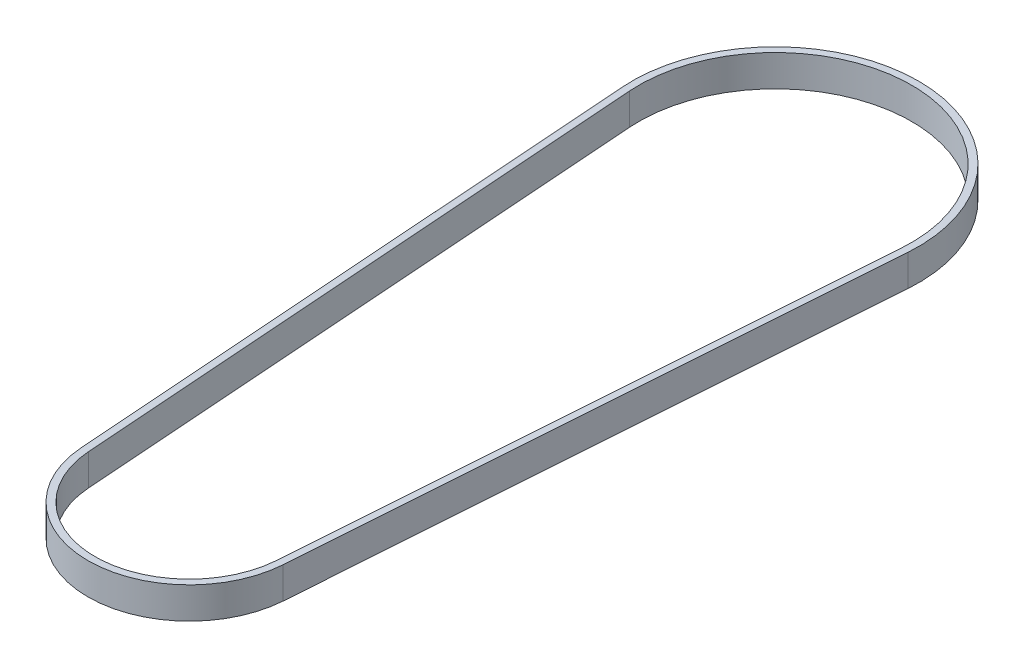
ISO-10303-21;
HEADER;
FILE_DESCRIPTION(('STEP AP214'),'2;1');
FILE_NAME('part.step','',(''),(''),'','','');
FILE_SCHEMA(('AUTOMOTIVE_DESIGN { 1 0 10303 214 1 1 1 1 }'));
ENDSEC;
DATA;
#1=APPLICATION_CONTEXT('core data for automotive mechanical design processes');
#2=APPLICATION_PROTOCOL_DEFINITION('international standard','automotive_design',2000,#1);
#3=PRODUCT_CONTEXT('',#1,'mechanical');
#4=PRODUCT('Part','Part','',(#3));
#5=PRODUCT_RELATED_PRODUCT_CATEGORY('part','',(#4));
#6=PRODUCT_DEFINITION_FORMATION('','',#4);
#7=PRODUCT_DEFINITION_CONTEXT('part definition',#1,'design');
#8=PRODUCT_DEFINITION('design','',#6,#7);
#9=PRODUCT_DEFINITION_SHAPE('','',#8);
#10=(LENGTH_UNIT() NAMED_UNIT(*) SI_UNIT(.MILLI.,.METRE.));
#11=(NAMED_UNIT(*) PLANE_ANGLE_UNIT() SI_UNIT($,.RADIAN.));
#12=(NAMED_UNIT(*) SI_UNIT($,.STERADIAN.) SOLID_ANGLE_UNIT());
#13=UNCERTAINTY_MEASURE_WITH_UNIT(LENGTH_MEASURE(1.E-05),#10,'distance_accuracy_value','');
#14=(GEOMETRIC_REPRESENTATION_CONTEXT(3) GLOBAL_UNCERTAINTY_ASSIGNED_CONTEXT((#13)) GLOBAL_UNIT_ASSIGNED_CONTEXT((#10,
#11,#12)) REPRESENTATION_CONTEXT('',''));
#15=CARTESIAN_POINT('',(0.,0.,0.));
#16=DIRECTION('',(0.,0.,1.));
#17=DIRECTION('',(1.,0.,0.));
#18=AXIS2_PLACEMENT_3D('',#15,#16,#17);
#19=CARTESIAN_POINT('',(0.,4.5,83.81));
#20=DIRECTION('',(0.,1.,0.));
#21=DIRECTION('',(0.,0.,1.));
#22=AXIS2_PLACEMENT_3D('',#19,#20,#21);
#23=PLANE('',#22);
#24=CARTESIAN_POINT('',(0.,4.5,83.81));
#25=DIRECTION('',(0.,1.,0.));
#26=DIRECTION('',(0.,0.,1.));
#27=AXIS2_PLACEMENT_3D('',#24,#25,#26);
#28=CIRCLE('',#27,14.5);
#29=CARTESIAN_POINT('',(-14.462794567271,4.5,84.848062283737));
#30=VERTEX_POINT('',#29);
#31=CARTESIAN_POINT('',(14.462794567271,4.5,84.848062283737));
#32=VERTEX_POINT('',#31);
#33=EDGE_CURVE('E159',#30,#32,#28,.T.);
#34=ORIENTED_EDGE('',*,*,#33,.T.);
#35=DIRECTION('',(0.0715905023266914,0.,-0.997434108087653));
#36=VECTOR('',#35,1.);
#37=CARTESIAN_POINT('',(20.4473992157969,4.5,1.46760529769717));
#38=LINE('',#37,#36);
#39=CARTESIAN_POINT('',(20.4473992157969,4.5,1.46760529769717));
#40=VERTEX_POINT('',#39);
#41=EDGE_CURVE('E163',#32,#40,#38,.T.);
#42=ORIENTED_EDGE('',*,*,#41,.T.);
#43=CARTESIAN_POINT('',(0.,4.5,0.));
#44=DIRECTION('',(0.,1.,0.));
#45=DIRECTION('',(0.,0.,1.));
#46=AXIS2_PLACEMENT_3D('',#43,#44,#45);
#47=CIRCLE('',#46,20.5);
#48=CARTESIAN_POINT('',(-20.4473992157969,4.5,1.46760529769717));
#49=VERTEX_POINT('',#48);
#50=EDGE_CURVE('E167',#40,#49,#47,.T.);
#51=ORIENTED_EDGE('',*,*,#50,.T.);
#52=DIRECTION('',(0.0715905023266914,0.,0.997434108087653));
#53=VECTOR('',#52,1.);
#54=CARTESIAN_POINT('',(-20.4473992157969,4.5,1.46760529769717));
#55=LINE('',#54,#53);
#56=EDGE_CURVE('E170',#49,#30,#55,.T.);
#57=ORIENTED_EDGE('',*,*,#56,.T.);
#58=EDGE_LOOP('',(#34,#42,#51,#57));
#59=FACE_BOUND('',#58,.T.);
#60=DIRECTION('',(0.0715905023266914,0.,0.997434108087653));
#61=VECTOR('',#60,1.);
#62=CARTESIAN_POINT('',(-19.4499651077092,4.5,1.39601479537047));
#63=LINE('',#62,#61);
#64=CARTESIAN_POINT('',(-19.4499651077092,4.5,1.39601479537047));
#65=VERTEX_POINT('',#64);
#66=CARTESIAN_POINT('',(-13.4653604591833,4.5,84.7764717814103));
#67=VERTEX_POINT('',#66);
#68=EDGE_CURVE('E120',#65,#67,#63,.T.);
#69=ORIENTED_EDGE('',*,*,#68,.F.);
#70=CARTESIAN_POINT('',(0.,4.5,0.));
#71=DIRECTION('',(0.,1.,0.));
#72=DIRECTION('',(0.,0.,1.));
#73=AXIS2_PLACEMENT_3D('',#70,#71,#72);
#74=CIRCLE('',#73,19.5);
#75=CARTESIAN_POINT('',(19.4499651077092,4.5,1.39601479537048));
#76=VERTEX_POINT('',#75);
#77=EDGE_CURVE('E111',#76,#65,#74,.T.);
#78=ORIENTED_EDGE('',*,*,#77,.F.);
#79=DIRECTION('',(0.0715905023266913,0.,-0.997434108087653));
#80=VECTOR('',#79,1.);
#81=CARTESIAN_POINT('',(19.4499651077092,4.5,1.39601479537048));
#82=LINE('',#81,#80);
#83=CARTESIAN_POINT('',(13.4653604591833,4.5,84.7764717814103));
#84=VERTEX_POINT('',#83);
#85=EDGE_CURVE('E137',#84,#76,#82,.T.);
#86=ORIENTED_EDGE('',*,*,#85,.F.);
#87=CARTESIAN_POINT('',(0.,4.5,83.81));
#88=DIRECTION('',(0.,1.,0.));
#89=DIRECTION('',(0.,0.,1.));
#90=AXIS2_PLACEMENT_3D('',#87,#88,#89);
#91=CIRCLE('',#90,13.5);
#92=EDGE_CURVE('E133',#67,#84,#91,.T.);
#93=ORIENTED_EDGE('',*,*,#92,.F.);
#94=EDGE_LOOP('',(#69,#78,#86,#93));
#95=FACE_BOUND('',#94,.T.);
#96=ADVANCED_FACE('F45',(#59,#95),#23,.T.);
#97=CARTESIAN_POINT('',(0.,0.,83.81));
#98=DIRECTION('',(0.,1.,0.));
#99=DIRECTION('',(0.,0.,1.));
#100=AXIS2_PLACEMENT_3D('',#97,#98,#99);
#101=PLANE('',#100);
#102=CARTESIAN_POINT('',(0.,0.,83.81));
#103=DIRECTION('',(0.,1.,0.));
#104=DIRECTION('',(0.,0.,1.));
#105=AXIS2_PLACEMENT_3D('',#102,#103,#104);
#106=CIRCLE('',#105,14.5);
#107=CARTESIAN_POINT('',(-14.462794567271,0.,84.848062283737));
#108=VERTEX_POINT('',#107);
#109=CARTESIAN_POINT('',(14.462794567271,0.,84.848062283737));
#110=VERTEX_POINT('',#109);
#111=EDGE_CURVE('E129',#108,#110,#106,.T.);
#112=ORIENTED_EDGE('',*,*,#111,.F.);
#113=DIRECTION('',(0.0715905023266914,0.,0.997434108087653));
#114=VECTOR('',#113,1.);
#115=CARTESIAN_POINT('',(-20.4473992157969,0.,1.46760529769717));
#116=LINE('',#115,#114);
#117=CARTESIAN_POINT('',(-20.4473992157969,0.,1.46760529769717));
#118=VERTEX_POINT('',#117);
#119=EDGE_CURVE('E164',#118,#108,#116,.T.);
#120=ORIENTED_EDGE('',*,*,#119,.F.);
#121=CARTESIAN_POINT('',(0.,0.,0.));
#122=DIRECTION('',(0.,1.,0.));
#123=DIRECTION('',(0.,0.,1.));
#124=AXIS2_PLACEMENT_3D('',#121,#122,#123);
#125=CIRCLE('',#124,20.5);
#126=CARTESIAN_POINT('',(20.4473992157969,0.,1.46760529769717));
#127=VERTEX_POINT('',#126);
#128=EDGE_CURVE('E180',#127,#118,#125,.T.);
#129=ORIENTED_EDGE('',*,*,#128,.F.);
#130=DIRECTION('',(0.0715905023266914,0.,-0.997434108087653));
#131=VECTOR('',#130,1.);
#132=CARTESIAN_POINT('',(20.4473992157969,0.,1.46760529769717));
#133=LINE('',#132,#131);
#134=EDGE_CURVE('E177',#110,#127,#133,.T.);
#135=ORIENTED_EDGE('',*,*,#134,.F.);
#136=EDGE_LOOP('',(#112,#120,#129,#135));
#137=FACE_BOUND('',#136,.T.);
#138=CARTESIAN_POINT('',(0.,0.,0.));
#139=DIRECTION('',(0.,1.,0.));
#140=DIRECTION('',(0.,0.,1.));
#141=AXIS2_PLACEMENT_3D('',#138,#139,#140);
#142=CIRCLE('',#141,19.5);
#143=CARTESIAN_POINT('',(19.4499651077092,0.,1.39601479537048));
#144=VERTEX_POINT('',#143);
#145=CARTESIAN_POINT('',(-19.4499651077092,0.,1.39601479537047));
#146=VERTEX_POINT('',#145);
#147=EDGE_CURVE('E69',#144,#146,#142,.T.);
#148=ORIENTED_EDGE('',*,*,#147,.T.);
#149=DIRECTION('',(0.0715905023266914,0.,0.997434108087653));
#150=VECTOR('',#149,1.);
#151=CARTESIAN_POINT('',(-19.4499651077092,0.,1.39601479537047));
#152=LINE('',#151,#150);
#153=CARTESIAN_POINT('',(-13.4653604591833,0.,84.7764717814103));
#154=VERTEX_POINT('',#153);
#155=EDGE_CURVE('E127',#146,#154,#152,.T.);
#156=ORIENTED_EDGE('',*,*,#155,.T.);
#157=CARTESIAN_POINT('',(0.,0.,83.81));
#158=DIRECTION('',(0.,1.,0.));
#159=DIRECTION('',(0.,0.,1.));
#160=AXIS2_PLACEMENT_3D('',#157,#158,#159);
#161=CIRCLE('',#160,13.5);
#162=CARTESIAN_POINT('',(13.4653604591833,0.,84.7764717814103));
#163=VERTEX_POINT('',#162);
#164=EDGE_CURVE('E146',#154,#163,#161,.T.);
#165=ORIENTED_EDGE('',*,*,#164,.T.);
#166=DIRECTION('',(0.0715905023266913,0.,-0.997434108087653));
#167=VECTOR('',#166,1.);
#168=CARTESIAN_POINT('',(19.4499651077092,0.,1.39601479537048));
#169=LINE('',#168,#167);
#170=EDGE_CURVE('E121',#163,#144,#169,.T.);
#171=ORIENTED_EDGE('',*,*,#170,.T.);
#172=EDGE_LOOP('',(#148,#156,#165,#171));
#173=FACE_BOUND('',#172,.T.);
#174=ADVANCED_FACE('F203',(#137,#173),#101,.F.);
#175=CARTESIAN_POINT('',(0.,4.5,83.81));
#176=DIRECTION('',(0.,-1.,0.));
#177=DIRECTION('',(0.,0.,-1.));
#178=AXIS2_PLACEMENT_3D('',#175,#176,#177);
#179=CYLINDRICAL_SURFACE('',#178,14.5);
#180=ORIENTED_EDGE('',*,*,#111,.T.);
#181=DIRECTION('',(0.,-1.,0.));
#182=VECTOR('',#181,1.);
#183=CARTESIAN_POINT('',(14.462794567271,4.5,84.848062283737));
#184=LINE('',#183,#182);
#185=EDGE_CURVE('E11',#32,#110,#184,.T.);
#186=ORIENTED_EDGE('',*,*,#185,.F.);
#187=ORIENTED_EDGE('',*,*,#33,.F.);
#188=DIRECTION('',(0.,-1.,0.));
#189=VECTOR('',#188,1.);
#190=CARTESIAN_POINT('',(-14.462794567271,4.5,84.848062283737));
#191=LINE('',#190,#189);
#192=EDGE_CURVE('E173',#30,#108,#191,.T.);
#193=ORIENTED_EDGE('',*,*,#192,.T.);
#194=EDGE_LOOP('',(#180,#186,#187,#193));
#195=FACE_BOUND('',#194,.T.);
#196=ADVANCED_FACE('F47',(#195),#179,.T.);
#197=CARTESIAN_POINT('',(20.4473992157969,4.5,1.46760529769717));
#198=DIRECTION('',(-0.997434108087653,0.,-0.0715905023266914));
#199=DIRECTION('',(-0.0715905023266914,0.,0.997434108087653));
#200=AXIS2_PLACEMENT_3D('',#197,#198,#199);
#201=PLANE('',#200);
#202=ORIENTED_EDGE('',*,*,#134,.T.);
#203=DIRECTION('',(0.,-1.,0.));
#204=VECTOR('',#203,1.);
#205=CARTESIAN_POINT('',(20.4473992157969,4.5,1.46760529769717));
#206=LINE('',#205,#204);
#207=EDGE_CURVE('E54',#40,#127,#206,.T.);
#208=ORIENTED_EDGE('',*,*,#207,.F.);
#209=ORIENTED_EDGE('',*,*,#41,.F.);
#210=ORIENTED_EDGE('',*,*,#185,.T.);
#211=EDGE_LOOP('',(#202,#208,#209,#210));
#212=FACE_BOUND('',#211,.T.);
#213=ADVANCED_FACE('F213',(#212),#201,.F.);
#214=CARTESIAN_POINT('',(0.,4.5,0.));
#215=DIRECTION('',(0.,-1.,0.));
#216=DIRECTION('',(0.,0.,-1.));
#217=AXIS2_PLACEMENT_3D('',#214,#215,#216);
#218=CYLINDRICAL_SURFACE('',#217,20.5);
#219=ORIENTED_EDGE('',*,*,#128,.T.);
#220=DIRECTION('',(0.,-1.,0.));
#221=VECTOR('',#220,1.);
#222=CARTESIAN_POINT('',(-20.4473992157969,4.5,1.46760529769717));
#223=LINE('',#222,#221);
#224=EDGE_CURVE('E188',#49,#118,#223,.T.);
#225=ORIENTED_EDGE('',*,*,#224,.F.);
#226=ORIENTED_EDGE('',*,*,#50,.F.);
#227=ORIENTED_EDGE('',*,*,#207,.T.);
#228=EDGE_LOOP('',(#219,#225,#226,#227));
#229=FACE_BOUND('',#228,.T.);
#230=ADVANCED_FACE('F197',(#229),#218,.T.);
#231=CARTESIAN_POINT('',(-20.4473992157969,4.5,1.46760529769717));
#232=DIRECTION('',(0.997434108087653,0.,-0.0715905023266914));
#233=DIRECTION('',(-0.0715905023266914,0.,-0.997434108087653));
#234=AXIS2_PLACEMENT_3D('',#231,#232,#233);
#235=PLANE('',#234);
#236=ORIENTED_EDGE('',*,*,#119,.T.);
#237=ORIENTED_EDGE('',*,*,#192,.F.);
#238=ORIENTED_EDGE('',*,*,#56,.F.);
#239=ORIENTED_EDGE('',*,*,#224,.T.);
#240=EDGE_LOOP('',(#236,#237,#238,#239));
#241=FACE_BOUND('',#240,.T.);
#242=ADVANCED_FACE('F207',(#241),#235,.F.);
#243=CARTESIAN_POINT('',(0.,4.5,0.));
#244=DIRECTION('',(0.,-1.,0.));
#245=DIRECTION('',(0.,0.,-1.));
#246=AXIS2_PLACEMENT_3D('',#243,#244,#245);
#247=CYLINDRICAL_SURFACE('',#246,19.5);
#248=ORIENTED_EDGE('',*,*,#147,.F.);
#249=DIRECTION('',(0.,-1.,0.));
#250=VECTOR('',#249,1.);
#251=CARTESIAN_POINT('',(19.4499651077092,4.5,1.39601479537048));
#252=LINE('',#251,#250);
#253=EDGE_CURVE('E115',#76,#144,#252,.T.);
#254=ORIENTED_EDGE('',*,*,#253,.F.);
#255=ORIENTED_EDGE('',*,*,#77,.T.);
#256=DIRECTION('',(0.,-1.,0.));
#257=VECTOR('',#256,1.);
#258=CARTESIAN_POINT('',(-19.4499651077092,4.5,1.39601479537047));
#259=LINE('',#258,#257);
#260=EDGE_CURVE('E114',#65,#146,#259,.T.);
#261=ORIENTED_EDGE('',*,*,#260,.T.);
#262=EDGE_LOOP('',(#248,#254,#255,#261));
#263=FACE_BOUND('',#262,.T.);
#264=ADVANCED_FACE('F113',(#263),#247,.F.);
#265=CARTESIAN_POINT('',(-19.4499651077092,4.5,1.39601479537047));
#266=DIRECTION('',(0.997434108087653,0.,-0.0715905023266914));
#267=DIRECTION('',(-0.0715905023266914,0.,-0.997434108087653));
#268=AXIS2_PLACEMENT_3D('',#265,#266,#267);
#269=PLANE('',#268);
#270=ORIENTED_EDGE('',*,*,#155,.F.);
#271=ORIENTED_EDGE('',*,*,#260,.F.);
#272=ORIENTED_EDGE('',*,*,#68,.T.);
#273=DIRECTION('',(0.,-1.,0.));
#274=VECTOR('',#273,1.);
#275=CARTESIAN_POINT('',(-13.4653604591833,4.5,84.7764717814103));
#276=LINE('',#275,#274);
#277=EDGE_CURVE('E130',#67,#154,#276,.T.);
#278=ORIENTED_EDGE('',*,*,#277,.T.);
#279=EDGE_LOOP('',(#270,#271,#272,#278));
#280=FACE_BOUND('',#279,.T.);
#281=ADVANCED_FACE('F124',(#280),#269,.T.);
#282=CARTESIAN_POINT('',(0.,4.5,83.81));
#283=DIRECTION('',(0.,-1.,0.));
#284=DIRECTION('',(0.,0.,-1.));
#285=AXIS2_PLACEMENT_3D('',#282,#283,#284);
#286=CYLINDRICAL_SURFACE('',#285,13.5);
#287=ORIENTED_EDGE('',*,*,#164,.F.);
#288=ORIENTED_EDGE('',*,*,#277,.F.);
#289=ORIENTED_EDGE('',*,*,#92,.T.);
#290=DIRECTION('',(0.,-1.,0.));
#291=VECTOR('',#290,1.);
#292=CARTESIAN_POINT('',(13.4653604591833,4.5,84.7764717814103));
#293=LINE('',#292,#291);
#294=EDGE_CURVE('E61',#84,#163,#293,.T.);
#295=ORIENTED_EDGE('',*,*,#294,.T.);
#296=EDGE_LOOP('',(#287,#288,#289,#295));
#297=FACE_BOUND('',#296,.T.);
#298=ADVANCED_FACE('F236',(#297),#286,.F.);
#299=CARTESIAN_POINT('',(19.4499651077092,4.5,1.39601479537048));
#300=DIRECTION('',(-0.997434108087653,0.,-0.0715905023266913));
#301=DIRECTION('',(-0.0715905023266913,0.,0.997434108087653));
#302=AXIS2_PLACEMENT_3D('',#299,#300,#301);
#303=PLANE('',#302);
#304=ORIENTED_EDGE('',*,*,#170,.F.);
#305=ORIENTED_EDGE('',*,*,#294,.F.);
#306=ORIENTED_EDGE('',*,*,#85,.T.);
#307=ORIENTED_EDGE('',*,*,#253,.T.);
#308=EDGE_LOOP('',(#304,#305,#306,#307));
#309=FACE_BOUND('',#308,.T.);
#310=ADVANCED_FACE('F240',(#309),#303,.T.);
#311=CLOSED_SHELL('',(#96,#174,#196,#213,#230,#242,#264,#281,#298,#310));
#312=MANIFOLD_SOLID_BREP('B2',#311);
#313=ADVANCED_BREP_SHAPE_REPRESENTATION('',(#18,#312),#14);
#314=SHAPE_DEFINITION_REPRESENTATION(#9,#313);
ENDSEC;
END-ISO-10303-21;
